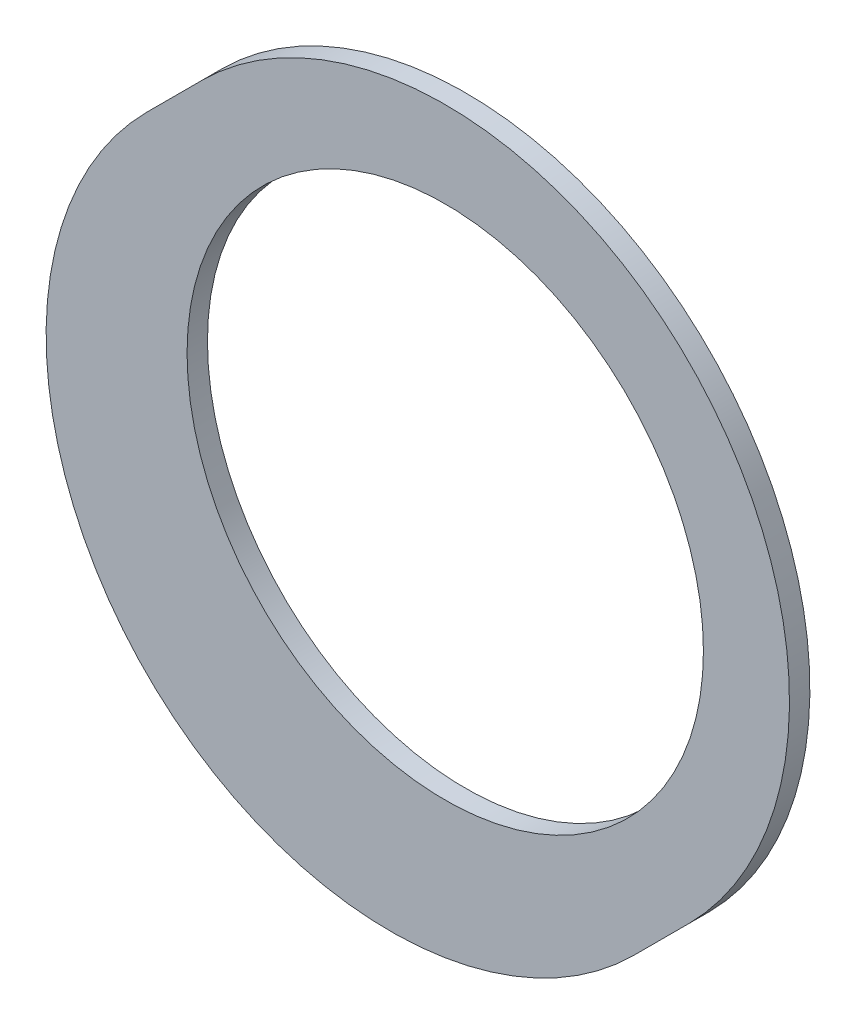
ISO-10303-21;
HEADER;
FILE_DESCRIPTION(('STEP AP214'),'2;1');
FILE_NAME('part.step','',(''),(''),'','','');
FILE_SCHEMA(('AUTOMOTIVE_DESIGN { 1 0 10303 214 1 1 1 1 }'));
ENDSEC;
DATA;
#1=APPLICATION_CONTEXT('core data for automotive mechanical design processes');
#2=APPLICATION_PROTOCOL_DEFINITION('international standard','automotive_design',2000,#1);
#3=PRODUCT_CONTEXT('',#1,'mechanical');
#4=PRODUCT('Part','Part','',(#3));
#5=PRODUCT_RELATED_PRODUCT_CATEGORY('part','',(#4));
#6=PRODUCT_DEFINITION_FORMATION('','',#4);
#7=PRODUCT_DEFINITION_CONTEXT('part definition',#1,'design');
#8=PRODUCT_DEFINITION('design','',#6,#7);
#9=PRODUCT_DEFINITION_SHAPE('','',#8);
#10=(LENGTH_UNIT() NAMED_UNIT(*) SI_UNIT(.MILLI.,.METRE.));
#11=(NAMED_UNIT(*) PLANE_ANGLE_UNIT() SI_UNIT($,.RADIAN.));
#12=(NAMED_UNIT(*) SI_UNIT($,.STERADIAN.) SOLID_ANGLE_UNIT());
#13=UNCERTAINTY_MEASURE_WITH_UNIT(LENGTH_MEASURE(1.E-05),#10,'distance_accuracy_value','');
#14=(GEOMETRIC_REPRESENTATION_CONTEXT(3) GLOBAL_UNCERTAINTY_ASSIGNED_CONTEXT((#13)) GLOBAL_UNIT_ASSIGNED_CONTEXT((#10,
#11,#12)) REPRESENTATION_CONTEXT('',''));
#15=CARTESIAN_POINT('',(0.,0.,0.));
#16=DIRECTION('',(0.,0.,1.));
#17=DIRECTION('',(1.,0.,0.));
#18=AXIS2_PLACEMENT_3D('',#15,#16,#17);
#19=CARTESIAN_POINT('',(36.18563502,70.48009018,0.));
#20=DIRECTION('',(-0.707106781186521,0.707106781186574,0.));
#21=DIRECTION('',(0.707106781186574,0.707106781186521,0.));
#22=AXIS2_PLACEMENT_3D('',#19,#20,#21);
#23=PLANE('',#22);
#24=DIRECTION('',(0.707106781186574,0.707106781186521,0.));
#25=VECTOR('',#24,1.);
#26=CARTESIAN_POINT('',(36.18563502,70.48009018,0.03556));
#27=LINE('',#26,#25);
#28=CARTESIAN_POINT('',(36.18563502,70.48009018,0.03556));
#29=VERTEX_POINT('',#28);
#30=CARTESIAN_POINT('',(36.28129142,70.57574658,0.03556));
#31=VERTEX_POINT('',#30);
#32=EDGE_CURVE('E11',#29,#31,#27,.T.);
#33=ORIENTED_EDGE('',*,*,#32,.F.);
#34=DIRECTION('',(0.,0.,1.));
#35=VECTOR('',#34,1.);
#36=CARTESIAN_POINT('',(36.18563502,70.48009018,0.));
#37=LINE('',#36,#35);
#38=CARTESIAN_POINT('',(36.18563502,70.48009018,0.));
#39=VERTEX_POINT('',#38);
#40=EDGE_CURVE('E24',#39,#29,#37,.T.);
#41=ORIENTED_EDGE('',*,*,#40,.F.);
#42=DIRECTION('',(0.707106781186574,0.707106781186521,0.));
#43=VECTOR('',#42,1.);
#44=CARTESIAN_POINT('',(36.18563502,70.48009018,0.));
#45=LINE('',#44,#43);
#46=CARTESIAN_POINT('',(36.28129142,70.57574658,0.));
#47=VERTEX_POINT('',#46);
#48=EDGE_CURVE('E96',#39,#47,#45,.T.);
#49=ORIENTED_EDGE('',*,*,#48,.T.);
#50=DIRECTION('',(0.,0.,1.));
#51=VECTOR('',#50,1.);
#52=CARTESIAN_POINT('',(36.28129142,70.57574658,0.));
#53=LINE('',#52,#51);
#54=EDGE_CURVE('E37',#47,#31,#53,.T.);
#55=ORIENTED_EDGE('',*,*,#54,.T.);
#56=EDGE_LOOP('',(#33,#41,#49,#55));
#57=FACE_BOUND('',#56,.T.);
#58=ADVANCED_FACE('F17',(#57),#23,.F.);
#59=CARTESIAN_POINT('',(35.7613712,70.904354,0.));
#60=DIRECTION('',(0.,0.,-1.));
#61=DIRECTION('',(-0.707106781186554,0.707106781186542,0.));
#62=AXIS2_PLACEMENT_3D('',#59,#60,#61);
#63=CYLINDRICAL_SURFACE('',#62,0.599999648268213);
#64=CARTESIAN_POINT('',(35.7613712,70.904354,0.03556));
#65=DIRECTION('',(0.,0.,1.));
#66=DIRECTION('',(-0.707106781186554,0.707106781186542,0.));
#67=AXIS2_PLACEMENT_3D('',#64,#65,#66);
#68=CIRCLE('',#67,0.599999648268213);
#69=CARTESIAN_POINT('',(35.33710738,71.32861782,0.03556));
#70=VERTEX_POINT('',#69);
#71=EDGE_CURVE('E92',#70,#29,#68,.T.);
#72=ORIENTED_EDGE('',*,*,#71,.F.);
#73=DIRECTION('',(0.,0.,1.));
#74=VECTOR('',#73,1.);
#75=CARTESIAN_POINT('',(35.33710738,71.32861782,0.));
#76=LINE('',#75,#74);
#77=CARTESIAN_POINT('',(35.33710738,71.32861782,0.));
#78=VERTEX_POINT('',#77);
#79=EDGE_CURVE('E90',#78,#70,#76,.T.);
#80=ORIENTED_EDGE('',*,*,#79,.F.);
#81=CARTESIAN_POINT('',(35.7613712,70.904354,0.));
#82=DIRECTION('',(0.,0.,1.));
#83=DIRECTION('',(-0.707106781186554,0.707106781186542,0.));
#84=AXIS2_PLACEMENT_3D('',#81,#82,#83);
#85=CIRCLE('',#84,0.599999648268213);
#86=EDGE_CURVE('E88',#78,#39,#85,.T.);
#87=ORIENTED_EDGE('',*,*,#86,.T.);
#88=ORIENTED_EDGE('',*,*,#40,.T.);
#89=EDGE_LOOP('',(#72,#80,#87,#88));
#90=FACE_BOUND('',#89,.T.);
#91=ADVANCED_FACE('F111',(#90),#63,.T.);
#92=CARTESIAN_POINT('',(35.8570276,71.0000104,0.));
#93=DIRECTION('',(0.,0.,-1.));
#94=DIRECTION('',(0.707106781186548,-0.707106781186548,0.));
#95=AXIS2_PLACEMENT_3D('',#92,#93,#94);
#96=CYLINDRICAL_SURFACE('',#95,0.599999648268219);
#97=CARTESIAN_POINT('',(35.8570276,71.0000104,0.03556));
#98=DIRECTION('',(0.,0.,1.));
#99=DIRECTION('',(0.707106781186548,-0.707106781186548,0.));
#100=AXIS2_PLACEMENT_3D('',#97,#98,#99);
#101=CIRCLE('',#100,0.599999648268219);
#102=CARTESIAN_POINT('',(35.43276378,71.42427422,0.03556));
#103=VERTEX_POINT('',#102);
#104=EDGE_CURVE('E85',#31,#103,#101,.T.);
#105=ORIENTED_EDGE('',*,*,#104,.F.);
#106=ORIENTED_EDGE('',*,*,#54,.F.);
#107=CARTESIAN_POINT('',(35.8570276,71.0000104,0.));
#108=DIRECTION('',(0.,0.,1.));
#109=DIRECTION('',(0.707106781186548,-0.707106781186548,0.));
#110=AXIS2_PLACEMENT_3D('',#107,#108,#109);
#111=CIRCLE('',#110,0.599999648268219);
#112=CARTESIAN_POINT('',(35.43276378,71.42427422,0.));
#113=VERTEX_POINT('',#112);
#114=EDGE_CURVE('E82',#47,#113,#111,.T.);
#115=ORIENTED_EDGE('',*,*,#114,.T.);
#116=DIRECTION('',(0.,0.,1.));
#117=VECTOR('',#116,1.);
#118=CARTESIAN_POINT('',(35.43276378,71.42427422,0.));
#119=LINE('',#118,#117);
#120=EDGE_CURVE('E80',#113,#103,#119,.T.);
#121=ORIENTED_EDGE('',*,*,#120,.T.);
#122=EDGE_LOOP('',(#105,#106,#115,#121));
#123=FACE_BOUND('',#122,.T.);
#124=ADVANCED_FACE('F104',(#123),#96,.T.);
#125=CARTESIAN_POINT('',(35.43276378,71.42427422,0.));
#126=DIRECTION('',(0.7071067811866,-0.707106781186495,0.));
#127=DIRECTION('',(-0.707106781186495,-0.7071067811866,0.));
#128=AXIS2_PLACEMENT_3D('',#125,#126,#127);
#129=PLANE('',#128);
#130=DIRECTION('',(-0.707106781186495,-0.7071067811866,0.));
#131=VECTOR('',#130,1.);
#132=CARTESIAN_POINT('',(35.43276378,71.42427422,0.03556));
#133=LINE('',#132,#131);
#134=EDGE_CURVE('E77',#103,#70,#133,.T.);
#135=ORIENTED_EDGE('',*,*,#134,.F.);
#136=ORIENTED_EDGE('',*,*,#120,.F.);
#137=DIRECTION('',(-0.707106781186495,-0.7071067811866,0.));
#138=VECTOR('',#137,1.);
#139=CARTESIAN_POINT('',(35.43276378,71.42427422,0.));
#140=LINE('',#139,#138);
#141=EDGE_CURVE('E68',#113,#78,#140,.T.);
#142=ORIENTED_EDGE('',*,*,#141,.T.);
#143=ORIENTED_EDGE('',*,*,#79,.T.);
#144=EDGE_LOOP('',(#135,#136,#142,#143));
#145=FACE_BOUND('',#144,.T.);
#146=ADVANCED_FACE('F110',(#145),#129,.F.);
#147=CARTESIAN_POINT('',(35.8570276,71.0000104,0.));
#148=DIRECTION('',(0.,0.,-1.));
#149=DIRECTION('',(1.,0.,0.));
#150=AXIS2_PLACEMENT_3D('',#147,#148,#149);
#151=CYLINDRICAL_SURFACE('',#150,0.4499991);
#152=DIRECTION('',(0.,0.,1.));
#153=VECTOR('',#152,1.);
#154=CARTESIAN_POINT('',(36.3070267,71.0000104,0.));
#155=LINE('',#154,#153);
#156=CARTESIAN_POINT('',(36.3070267,71.0000104,0.));
#157=VERTEX_POINT('',#156);
#158=CARTESIAN_POINT('',(36.3070267,71.0000104,0.03556));
#159=VERTEX_POINT('',#158);
#160=EDGE_CURVE('E62',#157,#159,#155,.T.);
#161=ORIENTED_EDGE('',*,*,#160,.T.);
#162=CARTESIAN_POINT('',(35.8570276,71.0000104,0.03556));
#163=DIRECTION('',(0.,0.,1.));
#164=DIRECTION('',(1.,0.,0.));
#165=AXIS2_PLACEMENT_3D('',#162,#163,#164);
#166=CIRCLE('',#165,0.4499991);
#167=EDGE_CURVE('E67',#159,#159,#166,.T.);
#168=ORIENTED_EDGE('',*,*,#167,.T.);
#169=ORIENTED_EDGE('',*,*,#160,.F.);
#170=CARTESIAN_POINT('',(35.8570276,71.0000104,0.));
#171=DIRECTION('',(0.,0.,1.));
#172=DIRECTION('',(1.,0.,0.));
#173=AXIS2_PLACEMENT_3D('',#170,#171,#172);
#174=CIRCLE('',#173,0.4499991);
#175=EDGE_CURVE('E65',#157,#157,#174,.T.);
#176=ORIENTED_EDGE('',*,*,#175,.F.);
#177=EDGE_LOOP('',(#161,#168,#169,#176));
#178=FACE_BOUND('',#177,.T.);
#179=ADVANCED_FACE('F64',(#178),#151,.F.);
#180=CARTESIAN_POINT('',(36.18563502,70.48009018,0.));
#181=DIRECTION('',(0.,0.,-1.));
#182=DIRECTION('',(-1.,0.,0.));
#183=AXIS2_PLACEMENT_3D('',#180,#181,#182);
#184=PLANE('',#183);
#185=ORIENTED_EDGE('',*,*,#48,.F.);
#186=ORIENTED_EDGE('',*,*,#86,.F.);
#187=ORIENTED_EDGE('',*,*,#141,.F.);
#188=ORIENTED_EDGE('',*,*,#114,.F.);
#189=EDGE_LOOP('',(#185,#186,#187,#188));
#190=FACE_BOUND('',#189,.T.);
#191=ORIENTED_EDGE('',*,*,#175,.T.);
#192=EDGE_LOOP('',(#191));
#193=FACE_BOUND('',#192,.T.);
#194=ADVANCED_FACE('F71',(#190,#193),#184,.T.);
#195=CARTESIAN_POINT('',(36.18563502,70.48009018,0.03556));
#196=DIRECTION('',(0.,0.,-1.));
#197=DIRECTION('',(-1.,0.,0.));
#198=AXIS2_PLACEMENT_3D('',#195,#196,#197);
#199=PLANE('',#198);
#200=ORIENTED_EDGE('',*,*,#134,.T.);
#201=ORIENTED_EDGE('',*,*,#71,.T.);
#202=ORIENTED_EDGE('',*,*,#32,.T.);
#203=ORIENTED_EDGE('',*,*,#104,.T.);
#204=EDGE_LOOP('',(#200,#201,#202,#203));
#205=FACE_BOUND('',#204,.T.);
#206=ORIENTED_EDGE('',*,*,#167,.F.);
#207=EDGE_LOOP('',(#206));
#208=FACE_BOUND('',#207,.T.);
#209=ADVANCED_FACE('F107',(#205,#208),#199,.F.);
#210=CLOSED_SHELL('',(#58,#91,#124,#146,#179,#194,#209));
#211=MANIFOLD_SOLID_BREP('B1',#210);
#212=ADVANCED_BREP_SHAPE_REPRESENTATION('',(#18,#211),#14);
#213=SHAPE_DEFINITION_REPRESENTATION(#9,#212);
ENDSEC;
END-ISO-10303-21;
